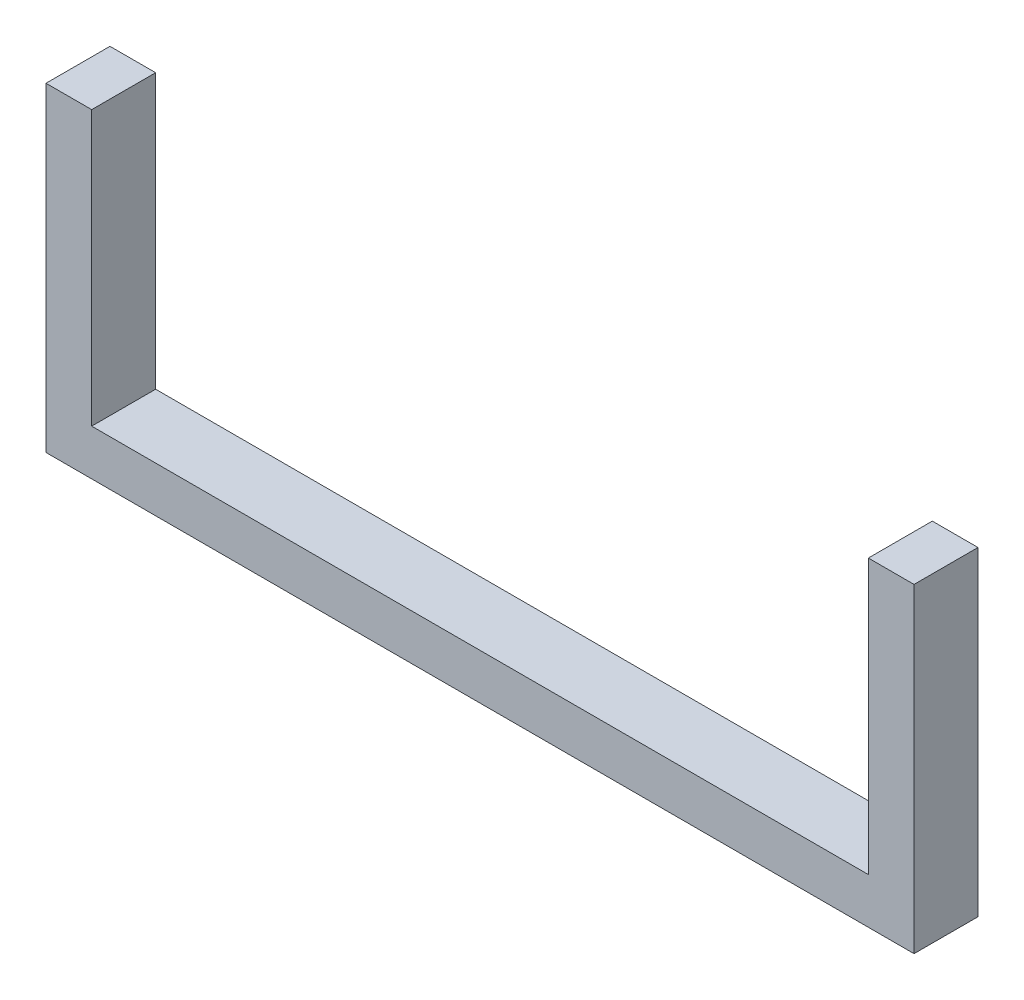
ISO-10303-21;
HEADER;
FILE_DESCRIPTION(('STEP AP214'),'2;1');
FILE_NAME('part.step','',(''),(''),'','','');
FILE_SCHEMA(('AUTOMOTIVE_DESIGN { 1 0 10303 214 1 1 1 1 }'));
ENDSEC;
DATA;
#1=APPLICATION_CONTEXT('core data for automotive mechanical design processes');
#2=APPLICATION_PROTOCOL_DEFINITION('international standard','automotive_design',2000,#1);
#3=PRODUCT_CONTEXT('',#1,'mechanical');
#4=PRODUCT('Part','Part','',(#3));
#5=PRODUCT_RELATED_PRODUCT_CATEGORY('part','',(#4));
#6=PRODUCT_DEFINITION_FORMATION('','',#4);
#7=PRODUCT_DEFINITION_CONTEXT('part definition',#1,'design');
#8=PRODUCT_DEFINITION('design','',#6,#7);
#9=PRODUCT_DEFINITION_SHAPE('','',#8);
#10=(LENGTH_UNIT() NAMED_UNIT(*) SI_UNIT(.MILLI.,.METRE.));
#11=(NAMED_UNIT(*) PLANE_ANGLE_UNIT() SI_UNIT($,.RADIAN.));
#12=(NAMED_UNIT(*) SI_UNIT($,.STERADIAN.) SOLID_ANGLE_UNIT());
#13=UNCERTAINTY_MEASURE_WITH_UNIT(LENGTH_MEASURE(1.E-05),#10,'distance_accuracy_value','');
#14=(GEOMETRIC_REPRESENTATION_CONTEXT(3) GLOBAL_UNCERTAINTY_ASSIGNED_CONTEXT((#13)) GLOBAL_UNIT_ASSIGNED_CONTEXT((#10,
#11,#12)) REPRESENTATION_CONTEXT('',''));
#15=CARTESIAN_POINT('',(0.,0.,0.));
#16=DIRECTION('',(0.,0.,1.));
#17=DIRECTION('',(1.,0.,0.));
#18=AXIS2_PLACEMENT_3D('',#15,#16,#17);
#19=CARTESIAN_POINT('',(0.,10.,0.));
#20=DIRECTION('',(0.,-1.,0.));
#21=DIRECTION('',(0.,0.,-1.));
#22=AXIS2_PLACEMENT_3D('',#19,#20,#21);
#23=PLANE('',#22);
#24=DIRECTION('',(0.,0.,1.));
#25=VECTOR('',#24,1.);
#26=CARTESIAN_POINT('',(180.,10.,0.));
#27=LINE('',#26,#25);
#28=CARTESIAN_POINT('',(180.,10.,-14.));
#29=VERTEX_POINT('',#28);
#30=CARTESIAN_POINT('',(180.,10.,0.));
#31=VERTEX_POINT('',#30);
#32=EDGE_CURVE('E122',#29,#31,#27,.T.);
#33=ORIENTED_EDGE('',*,*,#32,.F.);
#34=DIRECTION('',(-1.,0.,0.));
#35=VECTOR('',#34,1.);
#36=CARTESIAN_POINT('',(0.,10.,-14.));
#37=LINE('',#36,#35);
#38=CARTESIAN_POINT('',(10.,10.,-14.));
#39=VERTEX_POINT('',#38);
#40=EDGE_CURVE('E151',#29,#39,#37,.T.);
#41=ORIENTED_EDGE('',*,*,#40,.T.);
#42=DIRECTION('',(0.,0.,-1.));
#43=VECTOR('',#42,1.);
#44=CARTESIAN_POINT('',(10.,10.,-14.));
#45=LINE('',#44,#43);
#46=CARTESIAN_POINT('',(10.,10.,0.));
#47=VERTEX_POINT('',#46);
#48=EDGE_CURVE('E53',#47,#39,#45,.T.);
#49=ORIENTED_EDGE('',*,*,#48,.F.);
#50=DIRECTION('',(1.,0.,0.));
#51=VECTOR('',#50,1.);
#52=CARTESIAN_POINT('',(0.,10.,0.));
#53=LINE('',#52,#51);
#54=EDGE_CURVE('E48',#47,#31,#53,.T.);
#55=ORIENTED_EDGE('',*,*,#54,.T.);
#56=EDGE_LOOP('',(#33,#41,#49,#55));
#57=FACE_BOUND('',#56,.T.);
#58=ADVANCED_FACE('F33',(#57),#23,.F.);
#59=CARTESIAN_POINT('',(0.,10.,0.));
#60=DIRECTION('',(1.,0.,0.));
#61=DIRECTION('',(0.,0.,-1.));
#62=AXIS2_PLACEMENT_3D('',#59,#60,#61);
#63=PLANE('',#62);
#64=DIRECTION('',(0.,0.,1.));
#65=VECTOR('',#64,1.);
#66=CARTESIAN_POINT('',(0.,0.,0.));
#67=LINE('',#66,#65);
#68=CARTESIAN_POINT('',(0.,0.,-14.));
#69=VERTEX_POINT('',#68);
#70=CARTESIAN_POINT('',(0.,0.,0.));
#71=VERTEX_POINT('',#70);
#72=EDGE_CURVE('E149',#69,#71,#67,.T.);
#73=ORIENTED_EDGE('',*,*,#72,.T.);
#74=DIRECTION('',(0.,-1.,0.));
#75=VECTOR('',#74,1.);
#76=CARTESIAN_POINT('',(0.,10.,0.));
#77=LINE('',#76,#75);
#78=CARTESIAN_POINT('',(0.,70.,0.));
#79=VERTEX_POINT('',#78);
#80=EDGE_CURVE('E11',#79,#71,#77,.T.);
#81=ORIENTED_EDGE('',*,*,#80,.F.);
#82=DIRECTION('',(0.,0.,1.));
#83=VECTOR('',#82,1.);
#84=CARTESIAN_POINT('',(0.,70.,-14.));
#85=LINE('',#84,#83);
#86=CARTESIAN_POINT('',(0.,70.,-14.));
#87=VERTEX_POINT('',#86);
#88=EDGE_CURVE('E132',#87,#79,#85,.T.);
#89=ORIENTED_EDGE('',*,*,#88,.F.);
#90=DIRECTION('',(0.,-1.,0.));
#91=VECTOR('',#90,1.);
#92=CARTESIAN_POINT('',(0.,10.,-14.));
#93=LINE('',#92,#91);
#94=EDGE_CURVE('E107',#87,#69,#93,.T.);
#95=ORIENTED_EDGE('',*,*,#94,.T.);
#96=EDGE_LOOP('',(#73,#81,#89,#95));
#97=FACE_BOUND('',#96,.T.);
#98=ADVANCED_FACE('F35',(#97),#63,.F.);
#99=CARTESIAN_POINT('',(0.,10.,0.));
#100=DIRECTION('',(0.,0.,-1.));
#101=DIRECTION('',(-1.,0.,0.));
#102=AXIS2_PLACEMENT_3D('',#99,#100,#101);
#103=PLANE('',#102);
#104=DIRECTION('',(1.,0.,0.));
#105=VECTOR('',#104,1.);
#106=CARTESIAN_POINT('',(0.,0.,0.));
#107=LINE('',#106,#105);
#108=CARTESIAN_POINT('',(190.,0.,0.));
#109=VERTEX_POINT('',#108);
#110=EDGE_CURVE('E156',#71,#109,#107,.T.);
#111=ORIENTED_EDGE('',*,*,#110,.T.);
#112=DIRECTION('',(0.,-1.,0.));
#113=VECTOR('',#112,1.);
#114=CARTESIAN_POINT('',(190.,10.,0.));
#115=LINE('',#114,#113);
#116=CARTESIAN_POINT('',(190.,70.,0.));
#117=VERTEX_POINT('',#116);
#118=EDGE_CURVE('E41',#117,#109,#115,.T.);
#119=ORIENTED_EDGE('',*,*,#118,.F.);
#120=DIRECTION('',(1.,0.,0.));
#121=VECTOR('',#120,1.);
#122=CARTESIAN_POINT('',(190.,70.,0.));
#123=LINE('',#122,#121);
#124=CARTESIAN_POINT('',(180.,70.,0.));
#125=VERTEX_POINT('',#124);
#126=EDGE_CURVE('E121',#125,#117,#123,.T.);
#127=ORIENTED_EDGE('',*,*,#126,.F.);
#128=DIRECTION('',(0.,-1.,0.));
#129=VECTOR('',#128,1.);
#130=CARTESIAN_POINT('',(180.,70.,0.));
#131=LINE('',#130,#129);
#132=EDGE_CURVE('E127',#125,#31,#131,.T.);
#133=ORIENTED_EDGE('',*,*,#132,.T.);
#134=ORIENTED_EDGE('',*,*,#54,.F.);
#135=DIRECTION('',(0.,-1.,0.));
#136=VECTOR('',#135,1.);
#137=CARTESIAN_POINT('',(10.,70.,0.));
#138=LINE('',#137,#136);
#139=CARTESIAN_POINT('',(10.,70.,0.));
#140=VERTEX_POINT('',#139);
#141=EDGE_CURVE('E146',#140,#47,#138,.T.);
#142=ORIENTED_EDGE('',*,*,#141,.F.);
#143=DIRECTION('',(1.,0.,0.));
#144=VECTOR('',#143,1.);
#145=CARTESIAN_POINT('',(0.,70.,0.));
#146=LINE('',#145,#144);
#147=EDGE_CURVE('E135',#79,#140,#146,.T.);
#148=ORIENTED_EDGE('',*,*,#147,.F.);
#149=ORIENTED_EDGE('',*,*,#80,.T.);
#150=EDGE_LOOP('',(#111,#119,#127,#133,#134,#142,#148,#149));
#151=FACE_BOUND('',#150,.T.);
#152=ADVANCED_FACE('F176',(#151),#103,.F.);
#153=CARTESIAN_POINT('',(190.,10.,0.));
#154=DIRECTION('',(-1.,0.,0.));
#155=DIRECTION('',(0.,0.,1.));
#156=AXIS2_PLACEMENT_3D('',#153,#154,#155);
#157=PLANE('',#156);
#158=DIRECTION('',(0.,0.,-1.));
#159=VECTOR('',#158,1.);
#160=CARTESIAN_POINT('',(190.,0.,0.));
#161=LINE('',#160,#159);
#162=CARTESIAN_POINT('',(190.,0.,-14.));
#163=VERTEX_POINT('',#162);
#164=EDGE_CURVE('E104',#109,#163,#161,.T.);
#165=ORIENTED_EDGE('',*,*,#164,.T.);
#166=DIRECTION('',(0.,-1.,0.));
#167=VECTOR('',#166,1.);
#168=CARTESIAN_POINT('',(190.,10.,-14.));
#169=LINE('',#168,#167);
#170=CARTESIAN_POINT('',(190.,70.,-14.));
#171=VERTEX_POINT('',#170);
#172=EDGE_CURVE('E97',#171,#163,#169,.T.);
#173=ORIENTED_EDGE('',*,*,#172,.F.);
#174=DIRECTION('',(0.,0.,-1.));
#175=VECTOR('',#174,1.);
#176=CARTESIAN_POINT('',(190.,70.,0.));
#177=LINE('',#176,#175);
#178=EDGE_CURVE('E102',#117,#171,#177,.T.);
#179=ORIENTED_EDGE('',*,*,#178,.F.);
#180=ORIENTED_EDGE('',*,*,#118,.T.);
#181=EDGE_LOOP('',(#165,#173,#179,#180));
#182=FACE_BOUND('',#181,.T.);
#183=ADVANCED_FACE('F99',(#182),#157,.F.);
#184=CARTESIAN_POINT('',(0.,10.,-14.));
#185=DIRECTION('',(0.,0.,1.));
#186=DIRECTION('',(1.,0.,0.));
#187=AXIS2_PLACEMENT_3D('',#184,#185,#186);
#188=PLANE('',#187);
#189=DIRECTION('',(-1.,0.,0.));
#190=VECTOR('',#189,1.);
#191=CARTESIAN_POINT('',(0.,0.,-14.));
#192=LINE('',#191,#190);
#193=EDGE_CURVE('E152',#163,#69,#192,.T.);
#194=ORIENTED_EDGE('',*,*,#193,.T.);
#195=ORIENTED_EDGE('',*,*,#94,.F.);
#196=DIRECTION('',(-1.,0.,0.));
#197=VECTOR('',#196,1.);
#198=CARTESIAN_POINT('',(0.,70.,-14.));
#199=LINE('',#198,#197);
#200=CARTESIAN_POINT('',(10.,70.,-14.));
#201=VERTEX_POINT('',#200);
#202=EDGE_CURVE('E139',#201,#87,#199,.T.);
#203=ORIENTED_EDGE('',*,*,#202,.F.);
#204=DIRECTION('',(0.,-1.,0.));
#205=VECTOR('',#204,1.);
#206=CARTESIAN_POINT('',(10.,70.,-14.));
#207=LINE('',#206,#205);
#208=EDGE_CURVE('E142',#201,#39,#207,.T.);
#209=ORIENTED_EDGE('',*,*,#208,.T.);
#210=ORIENTED_EDGE('',*,*,#40,.F.);
#211=DIRECTION('',(0.,-1.,0.));
#212=VECTOR('',#211,1.);
#213=CARTESIAN_POINT('',(180.,70.,-14.));
#214=LINE('',#213,#212);
#215=CARTESIAN_POINT('',(180.,70.,-14.));
#216=VERTEX_POINT('',#215);
#217=EDGE_CURVE('E113',#216,#29,#214,.T.);
#218=ORIENTED_EDGE('',*,*,#217,.F.);
#219=DIRECTION('',(-1.,0.,0.));
#220=VECTOR('',#219,1.);
#221=CARTESIAN_POINT('',(190.,70.,-14.));
#222=LINE('',#221,#220);
#223=EDGE_CURVE('E110',#171,#216,#222,.T.);
#224=ORIENTED_EDGE('',*,*,#223,.F.);
#225=ORIENTED_EDGE('',*,*,#172,.T.);
#226=EDGE_LOOP('',(#194,#195,#203,#209,#210,#218,#224,#225));
#227=FACE_BOUND('',#226,.T.);
#228=ADVANCED_FACE('F111',(#227),#188,.F.);
#229=CARTESIAN_POINT('',(0.,0.,0.));
#230=DIRECTION('',(0.,-1.,0.));
#231=DIRECTION('',(0.,0.,-1.));
#232=AXIS2_PLACEMENT_3D('',#229,#230,#231);
#233=PLANE('',#232);
#234=ORIENTED_EDGE('',*,*,#72,.F.);
#235=ORIENTED_EDGE('',*,*,#193,.F.);
#236=ORIENTED_EDGE('',*,*,#164,.F.);
#237=ORIENTED_EDGE('',*,*,#110,.F.);
#238=EDGE_LOOP('',(#234,#235,#236,#237));
#239=FACE_BOUND('',#238,.T.);
#240=ADVANCED_FACE('F164',(#239),#233,.T.);
#241=CARTESIAN_POINT('',(10.,70.,-14.));
#242=DIRECTION('',(-1.,0.,0.));
#243=DIRECTION('',(0.,0.,1.));
#244=AXIS2_PLACEMENT_3D('',#241,#242,#243);
#245=PLANE('',#244);
#246=ORIENTED_EDGE('',*,*,#48,.T.);
#247=ORIENTED_EDGE('',*,*,#208,.F.);
#248=DIRECTION('',(0.,0.,-1.));
#249=VECTOR('',#248,1.);
#250=CARTESIAN_POINT('',(10.,70.,-14.));
#251=LINE('',#250,#249);
#252=EDGE_CURVE('E137',#140,#201,#251,.T.);
#253=ORIENTED_EDGE('',*,*,#252,.F.);
#254=ORIENTED_EDGE('',*,*,#141,.T.);
#255=EDGE_LOOP('',(#246,#247,#253,#254));
#256=FACE_BOUND('',#255,.T.);
#257=ADVANCED_FACE('F175',(#256),#245,.F.);
#258=CARTESIAN_POINT('',(0.,70.,0.));
#259=DIRECTION('',(0.,1.,0.));
#260=DIRECTION('',(0.,0.,1.));
#261=AXIS2_PLACEMENT_3D('',#258,#259,#260);
#262=PLANE('',#261);
#263=ORIENTED_EDGE('',*,*,#88,.T.);
#264=ORIENTED_EDGE('',*,*,#147,.T.);
#265=ORIENTED_EDGE('',*,*,#252,.T.);
#266=ORIENTED_EDGE('',*,*,#202,.T.);
#267=EDGE_LOOP('',(#263,#264,#265,#266));
#268=FACE_BOUND('',#267,.T.);
#269=ADVANCED_FACE('F170',(#268),#262,.T.);
#270=CARTESIAN_POINT('',(180.,70.,0.));
#271=DIRECTION('',(1.,0.,0.));
#272=DIRECTION('',(0.,0.,-1.));
#273=AXIS2_PLACEMENT_3D('',#270,#271,#272);
#274=PLANE('',#273);
#275=ORIENTED_EDGE('',*,*,#32,.T.);
#276=ORIENTED_EDGE('',*,*,#132,.F.);
#277=DIRECTION('',(0.,0.,1.));
#278=VECTOR('',#277,1.);
#279=CARTESIAN_POINT('',(180.,70.,0.));
#280=LINE('',#279,#278);
#281=EDGE_CURVE('E116',#216,#125,#280,.T.);
#282=ORIENTED_EDGE('',*,*,#281,.F.);
#283=ORIENTED_EDGE('',*,*,#217,.T.);
#284=EDGE_LOOP('',(#275,#276,#282,#283));
#285=FACE_BOUND('',#284,.T.);
#286=ADVANCED_FACE('F179',(#285),#274,.F.);
#287=CARTESIAN_POINT('',(0.,70.,0.));
#288=DIRECTION('',(0.,1.,0.));
#289=DIRECTION('',(0.,0.,1.));
#290=AXIS2_PLACEMENT_3D('',#287,#288,#289);
#291=PLANE('',#290);
#292=ORIENTED_EDGE('',*,*,#178,.T.);
#293=ORIENTED_EDGE('',*,*,#223,.T.);
#294=ORIENTED_EDGE('',*,*,#281,.T.);
#295=ORIENTED_EDGE('',*,*,#126,.T.);
#296=EDGE_LOOP('',(#292,#293,#294,#295));
#297=FACE_BOUND('',#296,.T.);
#298=ADVANCED_FACE('F119',(#297),#291,.T.);
#299=CLOSED_SHELL('',(#58,#98,#152,#183,#228,#240,#257,#269,#286,#298));
#300=MANIFOLD_SOLID_BREP('B2',#299);
#301=ADVANCED_BREP_SHAPE_REPRESENTATION('',(#18,#300),#14);
#302=SHAPE_DEFINITION_REPRESENTATION(#9,#301);
ENDSEC;
END-ISO-10303-21;
